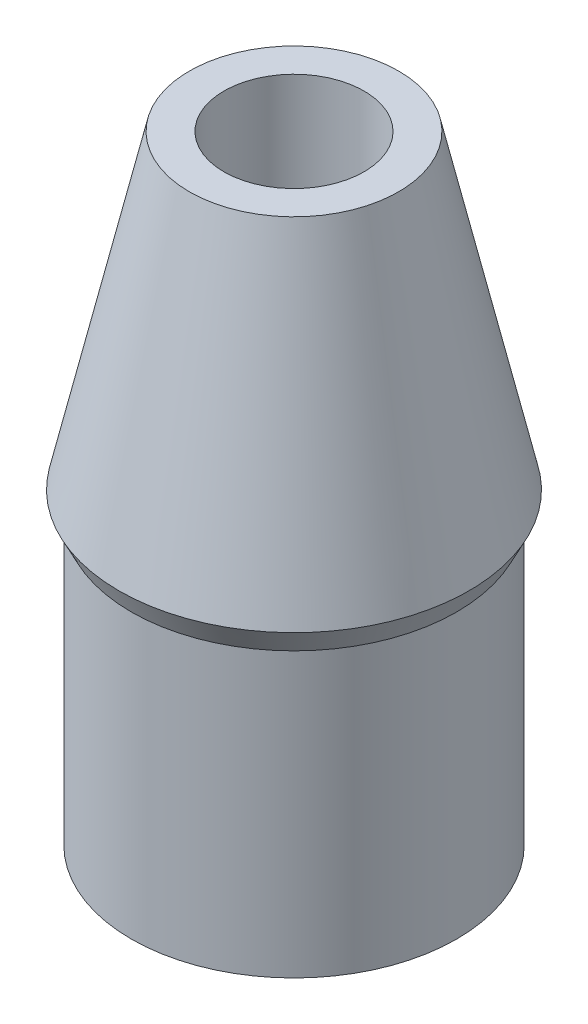
ISO-10303-21;
HEADER;
FILE_DESCRIPTION(('STEP AP214'),'2;1');
FILE_NAME('part.step','',(''),(''),'','','');
FILE_SCHEMA(('AUTOMOTIVE_DESIGN { 1 0 10303 214 1 1 1 1 }'));
ENDSEC;
DATA;
#1=APPLICATION_CONTEXT('core data for automotive mechanical design processes');
#2=APPLICATION_PROTOCOL_DEFINITION('international standard','automotive_design',2000,#1);
#3=PRODUCT_CONTEXT('',#1,'mechanical');
#4=PRODUCT('Part','Part','',(#3));
#5=PRODUCT_RELATED_PRODUCT_CATEGORY('part','',(#4));
#6=PRODUCT_DEFINITION_FORMATION('','',#4);
#7=PRODUCT_DEFINITION_CONTEXT('part definition',#1,'design');
#8=PRODUCT_DEFINITION('design','',#6,#7);
#9=PRODUCT_DEFINITION_SHAPE('','',#8);
#10=(LENGTH_UNIT() NAMED_UNIT(*) SI_UNIT(.MILLI.,.METRE.));
#11=(NAMED_UNIT(*) PLANE_ANGLE_UNIT() SI_UNIT($,.RADIAN.));
#12=(NAMED_UNIT(*) SI_UNIT($,.STERADIAN.) SOLID_ANGLE_UNIT());
#13=UNCERTAINTY_MEASURE_WITH_UNIT(LENGTH_MEASURE(1.E-05),#10,'distance_accuracy_value','');
#14=(GEOMETRIC_REPRESENTATION_CONTEXT(3) GLOBAL_UNCERTAINTY_ASSIGNED_CONTEXT((#13)) GLOBAL_UNIT_ASSIGNED_CONTEXT((#10,
#11,#12)) REPRESENTATION_CONTEXT('',''));
#15=CARTESIAN_POINT('',(0.,0.,0.));
#16=DIRECTION('',(0.,0.,1.));
#17=DIRECTION('',(1.,0.,0.));
#18=AXIS2_PLACEMENT_3D('',#15,#16,#17);
#19=CARTESIAN_POINT('',(5.15990187774307,16.51,0.));
#20=DIRECTION('',(0.,-1.,0.));
#21=DIRECTION('',(0.,0.,-1.));
#22=AXIS2_PLACEMENT_3D('',#19,#20,#21);
#23=PLANE('',#22);
#24=CARTESIAN_POINT('',(0.,16.51,0.));
#25=DIRECTION('',(0.,1.,0.));
#26=DIRECTION('',(0.,0.,1.));
#27=AXIS2_PLACEMENT_3D('',#24,#25,#26);
#28=CIRCLE('',#27,3.45439999999999);
#29=CARTESIAN_POINT('',(0.,16.51,3.45439999999999));
#30=VERTEX_POINT('',#29);
#31=EDGE_CURVE('E57',#30,#30,#28,.T.);
#32=ORIENTED_EDGE('',*,*,#31,.F.);
#33=EDGE_LOOP('',(#32));
#34=FACE_BOUND('',#33,.T.);
#35=CARTESIAN_POINT('',(0.,16.51,0.));
#36=DIRECTION('',(0.,1.,0.));
#37=DIRECTION('',(0.,0.,1.));
#38=AXIS2_PLACEMENT_3D('',#35,#36,#37);
#39=CIRCLE('',#38,5.15990187774307);
#40=CARTESIAN_POINT('',(0.,16.51,5.15990187774307));
#41=VERTEX_POINT('',#40);
#42=EDGE_CURVE('E11',#41,#41,#39,.T.);
#43=ORIENTED_EDGE('',*,*,#42,.T.);
#44=EDGE_LOOP('',(#43));
#45=FACE_BOUND('',#44,.T.);
#46=ADVANCED_FACE('F37',(#34,#45),#23,.F.);
#47=CARTESIAN_POINT('',(0.,1.20403255095323,0.));
#48=DIRECTION('',(0.,-1.,0.));
#49=DIRECTION('',(0.,0.,-1.));
#50=AXIS2_PLACEMENT_3D('',#47,#48,#49);
#51=CONICAL_SURFACE('',#50,8.63084342460048,0.222998968007678);
#52=ORIENTED_EDGE('',*,*,#42,.F.);
#53=EDGE_LOOP('',(#52));
#54=FACE_BOUND('',#53,.T.);
#55=CARTESIAN_POINT('',(0.,1.20403255095323,0.));
#56=DIRECTION('',(0.,1.,0.));
#57=DIRECTION('',(0.,0.,1.));
#58=AXIS2_PLACEMENT_3D('',#55,#56,#57);
#59=CIRCLE('',#58,8.63084342460048);
#60=CARTESIAN_POINT('',(0.,1.20403255095323,8.63084342460048));
#61=VERTEX_POINT('',#60);
#62=EDGE_CURVE('E43',#61,#61,#59,.T.);
#63=ORIENTED_EDGE('',*,*,#62,.T.);
#64=EDGE_LOOP('',(#63));
#65=FACE_BOUND('',#64,.T.);
#66=ADVANCED_FACE('F69',(#54,#65),#51,.T.);
#67=CARTESIAN_POINT('',(0.,0.,0.));
#68=DIRECTION('',(0.,1.,0.));
#69=DIRECTION('',(0.,0.,1.));
#70=AXIS2_PLACEMENT_3D('',#67,#68,#69);
#71=CONICAL_SURFACE('',#70,8.0264,0.465258988355768);
#72=ORIENTED_EDGE('',*,*,#62,.F.);
#73=EDGE_LOOP('',(#72));
#74=FACE_BOUND('',#73,.T.);
#75=CARTESIAN_POINT('',(0.,0.,0.));
#76=DIRECTION('',(0.,1.,0.));
#77=DIRECTION('',(0.,0.,1.));
#78=AXIS2_PLACEMENT_3D('',#75,#76,#77);
#79=CIRCLE('',#78,8.0264);
#80=CARTESIAN_POINT('',(0.,0.,8.0264));
#81=VERTEX_POINT('',#80);
#82=EDGE_CURVE('E60',#81,#81,#79,.T.);
#83=ORIENTED_EDGE('',*,*,#82,.T.);
#84=EDGE_LOOP('',(#83));
#85=FACE_BOUND('',#84,.T.);
#86=ADVANCED_FACE('F71',(#74,#85),#71,.T.);
#87=CARTESIAN_POINT('',(0.,16.51,0.));
#88=DIRECTION('',(0.,1.,0.));
#89=DIRECTION('',(0.,0.,1.));
#90=AXIS2_PLACEMENT_3D('',#87,#88,#89);
#91=CYLINDRICAL_SURFACE('',#90,8.0264);
#92=ORIENTED_EDGE('',*,*,#82,.F.);
#93=EDGE_LOOP('',(#92));
#94=FACE_BOUND('',#93,.T.);
#95=CARTESIAN_POINT('',(0.,-13.97,0.));
#96=DIRECTION('',(0.,1.,0.));
#97=DIRECTION('',(0.,0.,1.));
#98=AXIS2_PLACEMENT_3D('',#95,#96,#97);
#99=CIRCLE('',#98,8.0264);
#100=CARTESIAN_POINT('',(0.,-13.97,8.0264));
#101=VERTEX_POINT('',#100);
#102=EDGE_CURVE('E56',#101,#101,#99,.T.);
#103=ORIENTED_EDGE('',*,*,#102,.T.);
#104=EDGE_LOOP('',(#103));
#105=FACE_BOUND('',#104,.T.);
#106=ADVANCED_FACE('F74',(#94,#105),#91,.T.);
#107=CARTESIAN_POINT('',(8.0264,-13.97,0.));
#108=DIRECTION('',(0.,1.,0.));
#109=DIRECTION('',(0.,0.,1.));
#110=AXIS2_PLACEMENT_3D('',#107,#108,#109);
#111=PLANE('',#110);
#112=ORIENTED_EDGE('',*,*,#102,.F.);
#113=EDGE_LOOP('',(#112));
#114=FACE_BOUND('',#113,.T.);
#115=ADVANCED_FACE('F50',(#114),#111,.F.);
#116=CARTESIAN_POINT('',(0.,-4.66089999999999,0.));
#117=DIRECTION('',(0.,1.,0.));
#118=DIRECTION('',(0.,0.,1.));
#119=AXIS2_PLACEMENT_3D('',#116,#117,#118);
#120=CONICAL_SURFACE('',#119,3.45439999999999,1.02974425867665);
#121=CARTESIAN_POINT('',(0.,-6.73651292236879,0.));
#122=VERTEX_POINT('',#121);
#123=VERTEX_LOOP('',#122);
#124=FACE_BOUND('',#123,.T.);
#125=CARTESIAN_POINT('',(0.,-4.66089999999999,0.));
#126=DIRECTION('',(0.,1.,0.));
#127=DIRECTION('',(0.,0.,1.));
#128=AXIS2_PLACEMENT_3D('',#125,#126,#127);
#129=CIRCLE('',#128,3.45439999999999);
#130=CARTESIAN_POINT('',(0.,-4.66089999999999,3.45439999999999));
#131=VERTEX_POINT('',#130);
#132=EDGE_CURVE('E54',#131,#131,#129,.T.);
#133=ORIENTED_EDGE('',*,*,#132,.T.);
#134=EDGE_LOOP('',(#133));
#135=FACE_BOUND('',#134,.T.);
#136=ADVANCED_FACE('F46',(#124,#135),#120,.F.);
#137=CARTESIAN_POINT('',(0.,16.51,0.));
#138=DIRECTION('',(0.,1.,0.));
#139=DIRECTION('',(0.,0.,1.));
#140=AXIS2_PLACEMENT_3D('',#137,#138,#139);
#141=CYLINDRICAL_SURFACE('',#140,3.45439999999999);
#142=ORIENTED_EDGE('',*,*,#132,.F.);
#143=EDGE_LOOP('',(#142));
#144=FACE_BOUND('',#143,.T.);
#145=ORIENTED_EDGE('',*,*,#31,.T.);
#146=EDGE_LOOP('',(#145));
#147=FACE_BOUND('',#146,.T.);
#148=ADVANCED_FACE('F49',(#144,#147),#141,.F.);
#149=CLOSED_SHELL('',(#46,#66,#86,#106,#115,#136,#148));
#150=MANIFOLD_SOLID_BREP('B2',#149);
#151=ADVANCED_BREP_SHAPE_REPRESENTATION('',(#18,#150),#14);
#152=SHAPE_DEFINITION_REPRESENTATION(#9,#151);
ENDSEC;
END-ISO-10303-21;
